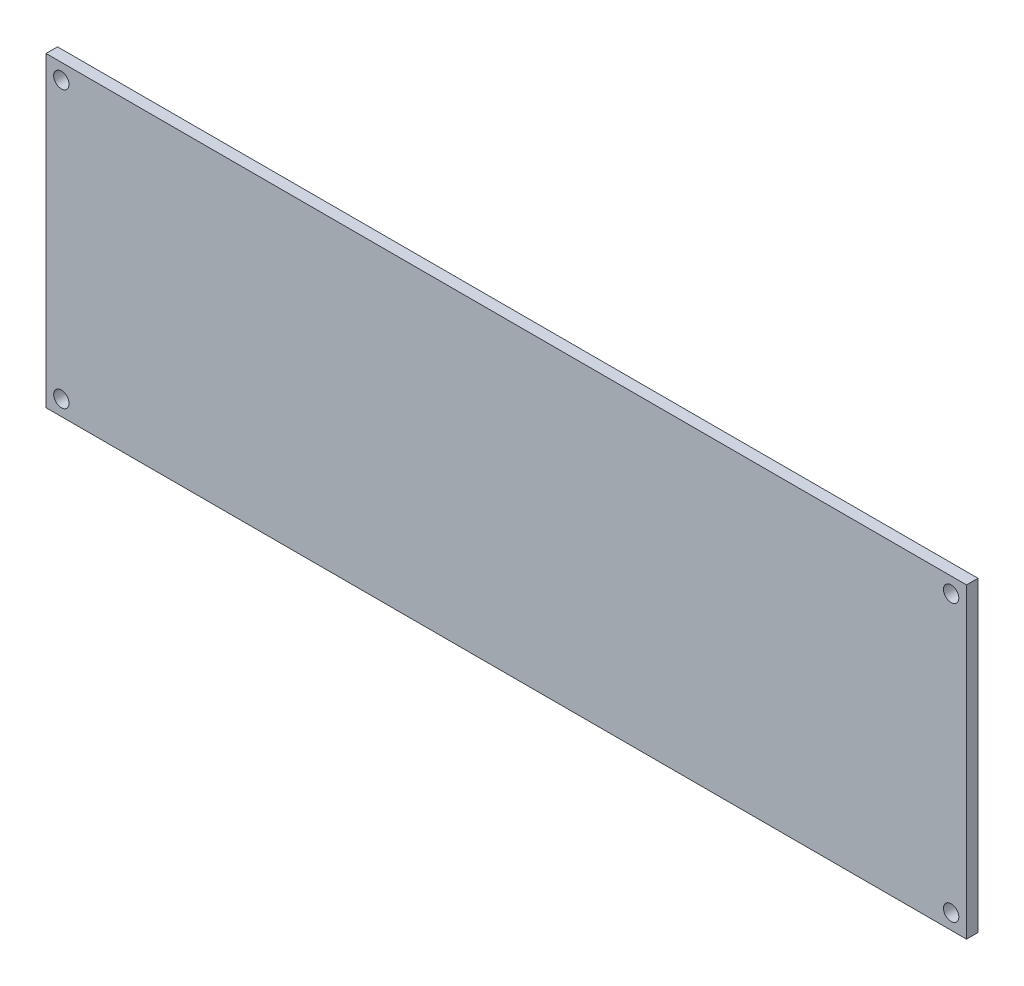
ISO-10303-21;
HEADER;
FILE_DESCRIPTION(('STEP AP214'),'2;1');
FILE_NAME('part.step','',(''),(''),'','','');
FILE_SCHEMA(('AUTOMOTIVE_DESIGN { 1 0 10303 214 1 1 1 1 }'));
ENDSEC;
DATA;
#1=APPLICATION_CONTEXT('core data for automotive mechanical design processes');
#2=APPLICATION_PROTOCOL_DEFINITION('international standard','automotive_design',2000,#1);
#3=PRODUCT_CONTEXT('',#1,'mechanical');
#4=PRODUCT('Part','Part','',(#3));
#5=PRODUCT_RELATED_PRODUCT_CATEGORY('part','',(#4));
#6=PRODUCT_DEFINITION_FORMATION('','',#4);
#7=PRODUCT_DEFINITION_CONTEXT('part definition',#1,'design');
#8=PRODUCT_DEFINITION('design','',#6,#7);
#9=PRODUCT_DEFINITION_SHAPE('','',#8);
#10=(LENGTH_UNIT() NAMED_UNIT(*) SI_UNIT(.MILLI.,.METRE.));
#11=(NAMED_UNIT(*) PLANE_ANGLE_UNIT() SI_UNIT($,.RADIAN.));
#12=(NAMED_UNIT(*) SI_UNIT($,.STERADIAN.) SOLID_ANGLE_UNIT());
#13=UNCERTAINTY_MEASURE_WITH_UNIT(LENGTH_MEASURE(1.E-05),#10,'distance_accuracy_value','');
#14=(GEOMETRIC_REPRESENTATION_CONTEXT(3) GLOBAL_UNCERTAINTY_ASSIGNED_CONTEXT((#13)) GLOBAL_UNIT_ASSIGNED_CONTEXT((#10,
#11,#12)) REPRESENTATION_CONTEXT('',''));
#15=CARTESIAN_POINT('',(0.,0.,0.));
#16=DIRECTION('',(0.,0.,1.));
#17=DIRECTION('',(1.,0.,0.));
#18=AXIS2_PLACEMENT_3D('',#15,#16,#17);
#19=CARTESIAN_POINT('',(0.,0.,1.5));
#20=DIRECTION('',(0.,0.,-1.));
#21=DIRECTION('',(-1.,0.,0.));
#22=AXIS2_PLACEMENT_3D('',#19,#20,#21);
#23=PLANE('',#22);
#24=DIRECTION('',(0.,-1.,0.));
#25=VECTOR('',#24,1.);
#26=CARTESIAN_POINT('',(0.,0.,1.5));
#27=LINE('',#26,#25);
#28=CARTESIAN_POINT('',(0.,40.,1.5));
#29=VERTEX_POINT('',#28);
#30=CARTESIAN_POINT('',(0.,0.,1.5));
#31=VERTEX_POINT('',#30);
#32=EDGE_CURVE('E92',#29,#31,#27,.T.);
#33=ORIENTED_EDGE('',*,*,#32,.T.);
#34=DIRECTION('',(1.,0.,0.));
#35=VECTOR('',#34,1.);
#36=CARTESIAN_POINT('',(0.,0.,1.5));
#37=LINE('',#36,#35);
#38=CARTESIAN_POINT('',(120.,0.,1.5));
#39=VERTEX_POINT('',#38);
#40=EDGE_CURVE('E87',#31,#39,#37,.T.);
#41=ORIENTED_EDGE('',*,*,#40,.T.);
#42=DIRECTION('',(0.,1.,0.));
#43=VECTOR('',#42,1.);
#44=CARTESIAN_POINT('',(120.,0.,1.5));
#45=LINE('',#44,#43);
#46=CARTESIAN_POINT('',(120.,40.,1.5));
#47=VERTEX_POINT('',#46);
#48=EDGE_CURVE('E90',#39,#47,#45,.T.);
#49=ORIENTED_EDGE('',*,*,#48,.T.);
#50=DIRECTION('',(-1.,0.,0.));
#51=VECTOR('',#50,1.);
#52=CARTESIAN_POINT('',(0.,40.,1.5));
#53=LINE('',#52,#51);
#54=EDGE_CURVE('E57',#47,#29,#53,.T.);
#55=ORIENTED_EDGE('',*,*,#54,.T.);
#56=EDGE_LOOP('',(#33,#41,#49,#55));
#57=FACE_BOUND('',#56,.T.);
#58=CARTESIAN_POINT('',(2.,38.,1.5));
#59=DIRECTION('',(0.,0.,1.));
#60=DIRECTION('',(1.,0.,0.));
#61=AXIS2_PLACEMENT_3D('',#58,#59,#60);
#62=CIRCLE('',#61,1.);
#63=CARTESIAN_POINT('',(3.,38.,1.5));
#64=VERTEX_POINT('',#63);
#65=EDGE_CURVE('E112',#64,#64,#62,.T.);
#66=ORIENTED_EDGE('',*,*,#65,.F.);
#67=EDGE_LOOP('',(#66));
#68=FACE_BOUND('',#67,.T.);
#69=CARTESIAN_POINT('',(118.,37.9999999999998,1.5));
#70=DIRECTION('',(0.,0.,1.));
#71=DIRECTION('',(-1.,0.,0.));
#72=AXIS2_PLACEMENT_3D('',#69,#70,#71);
#73=CIRCLE('',#72,0.999999999999985);
#74=CARTESIAN_POINT('',(117.,37.9999999999998,1.5));
#75=VERTEX_POINT('',#74);
#76=EDGE_CURVE('E134',#75,#75,#73,.T.);
#77=ORIENTED_EDGE('',*,*,#76,.F.);
#78=EDGE_LOOP('',(#77));
#79=FACE_BOUND('',#78,.T.);
#80=CARTESIAN_POINT('',(118.,2.00000000000022,1.5));
#81=DIRECTION('',(0.,0.,1.));
#82=DIRECTION('',(1.,0.,0.));
#83=AXIS2_PLACEMENT_3D('',#80,#81,#82);
#84=CIRCLE('',#83,0.999999999999985);
#85=CARTESIAN_POINT('',(119.,2.00000000000022,1.5));
#86=VERTEX_POINT('',#85);
#87=EDGE_CURVE('E142',#86,#86,#84,.T.);
#88=ORIENTED_EDGE('',*,*,#87,.F.);
#89=EDGE_LOOP('',(#88));
#90=FACE_BOUND('',#89,.T.);
#91=CARTESIAN_POINT('',(2.,2.,1.5));
#92=DIRECTION('',(0.,0.,1.));
#93=DIRECTION('',(-1.,0.,0.));
#94=AXIS2_PLACEMENT_3D('',#91,#92,#93);
#95=CIRCLE('',#94,1.);
#96=CARTESIAN_POINT('',(1.,2.,1.5));
#97=VERTEX_POINT('',#96);
#98=EDGE_CURVE('E150',#97,#97,#95,.T.);
#99=ORIENTED_EDGE('',*,*,#98,.F.);
#100=EDGE_LOOP('',(#99));
#101=FACE_BOUND('',#100,.T.);
#102=ADVANCED_FACE('F39',(#57,#68,#79,#90,#101),#23,.F.);
#103=CARTESIAN_POINT('',(0.,0.,0.));
#104=DIRECTION('',(0.,0.,-1.));
#105=DIRECTION('',(-1.,0.,0.));
#106=AXIS2_PLACEMENT_3D('',#103,#104,#105);
#107=PLANE('',#106);
#108=CARTESIAN_POINT('',(118.,2.00000000000022,0.));
#109=DIRECTION('',(0.,0.,1.));
#110=DIRECTION('',(1.,0.,0.));
#111=AXIS2_PLACEMENT_3D('',#108,#109,#110);
#112=CIRCLE('',#111,0.999999999999985);
#113=CARTESIAN_POINT('',(119.,2.00000000000022,0.));
#114=VERTEX_POINT('',#113);
#115=EDGE_CURVE('E146',#114,#114,#112,.T.);
#116=ORIENTED_EDGE('',*,*,#115,.T.);
#117=EDGE_LOOP('',(#116));
#118=FACE_BOUND('',#117,.T.);
#119=CARTESIAN_POINT('',(2.,38.,0.));
#120=DIRECTION('',(0.,0.,1.));
#121=DIRECTION('',(1.,0.,0.));
#122=AXIS2_PLACEMENT_3D('',#119,#120,#121);
#123=CIRCLE('',#122,1.);
#124=CARTESIAN_POINT('',(3.,38.,0.));
#125=VERTEX_POINT('',#124);
#126=EDGE_CURVE('E130',#125,#125,#123,.T.);
#127=ORIENTED_EDGE('',*,*,#126,.T.);
#128=EDGE_LOOP('',(#127));
#129=FACE_BOUND('',#128,.T.);
#130=DIRECTION('',(0.,-1.,0.));
#131=VECTOR('',#130,1.);
#132=CARTESIAN_POINT('',(0.,0.,0.));
#133=LINE('',#132,#131);
#134=CARTESIAN_POINT('',(0.,40.,0.));
#135=VERTEX_POINT('',#134);
#136=CARTESIAN_POINT('',(0.,0.,0.));
#137=VERTEX_POINT('',#136);
#138=EDGE_CURVE('E108',#135,#137,#133,.T.);
#139=ORIENTED_EDGE('',*,*,#138,.F.);
#140=DIRECTION('',(-1.,0.,0.));
#141=VECTOR('',#140,1.);
#142=CARTESIAN_POINT('',(0.,40.,0.));
#143=LINE('',#142,#141);
#144=CARTESIAN_POINT('',(120.,40.,0.));
#145=VERTEX_POINT('',#144);
#146=EDGE_CURVE('E80',#145,#135,#143,.T.);
#147=ORIENTED_EDGE('',*,*,#146,.F.);
#148=DIRECTION('',(0.,1.,0.));
#149=VECTOR('',#148,1.);
#150=CARTESIAN_POINT('',(120.,0.,0.));
#151=LINE('',#150,#149);
#152=CARTESIAN_POINT('',(120.,0.,0.));
#153=VERTEX_POINT('',#152);
#154=EDGE_CURVE('E74',#153,#145,#151,.T.);
#155=ORIENTED_EDGE('',*,*,#154,.F.);
#156=DIRECTION('',(1.,0.,0.));
#157=VECTOR('',#156,1.);
#158=CARTESIAN_POINT('',(0.,0.,0.));
#159=LINE('',#158,#157);
#160=EDGE_CURVE('E97',#137,#153,#159,.T.);
#161=ORIENTED_EDGE('',*,*,#160,.F.);
#162=EDGE_LOOP('',(#139,#147,#155,#161));
#163=FACE_BOUND('',#162,.T.);
#164=CARTESIAN_POINT('',(118.,37.9999999999998,0.));
#165=DIRECTION('',(0.,0.,1.));
#166=DIRECTION('',(-1.,0.,0.));
#167=AXIS2_PLACEMENT_3D('',#164,#165,#166);
#168=CIRCLE('',#167,0.999999999999985);
#169=CARTESIAN_POINT('',(117.,37.9999999999998,0.));
#170=VERTEX_POINT('',#169);
#171=EDGE_CURVE('E138',#170,#170,#168,.T.);
#172=ORIENTED_EDGE('',*,*,#171,.T.);
#173=EDGE_LOOP('',(#172));
#174=FACE_BOUND('',#173,.T.);
#175=CARTESIAN_POINT('',(2.,2.,0.));
#176=DIRECTION('',(0.,0.,1.));
#177=DIRECTION('',(-1.,0.,0.));
#178=AXIS2_PLACEMENT_3D('',#175,#176,#177);
#179=CIRCLE('',#178,1.);
#180=CARTESIAN_POINT('',(1.,2.,0.));
#181=VERTEX_POINT('',#180);
#182=EDGE_CURVE('E154',#181,#181,#179,.T.);
#183=ORIENTED_EDGE('',*,*,#182,.T.);
#184=EDGE_LOOP('',(#183));
#185=FACE_BOUND('',#184,.T.);
#186=ADVANCED_FACE('F125',(#118,#129,#163,#174,#185),#107,.T.);
#187=CARTESIAN_POINT('',(0.,0.,1.5));
#188=DIRECTION('',(1.,0.,0.));
#189=DIRECTION('',(0.,0.,-1.));
#190=AXIS2_PLACEMENT_3D('',#187,#188,#189);
#191=PLANE('',#190);
#192=ORIENTED_EDGE('',*,*,#138,.T.);
#193=DIRECTION('',(0.,0.,-1.));
#194=VECTOR('',#193,1.);
#195=CARTESIAN_POINT('',(0.,0.,1.5));
#196=LINE('',#195,#194);
#197=EDGE_CURVE('E11',#31,#137,#196,.T.);
#198=ORIENTED_EDGE('',*,*,#197,.F.);
#199=ORIENTED_EDGE('',*,*,#32,.F.);
#200=DIRECTION('',(0.,0.,-1.));
#201=VECTOR('',#200,1.);
#202=CARTESIAN_POINT('',(0.,40.,1.5));
#203=LINE('',#202,#201);
#204=EDGE_CURVE('E104',#29,#135,#203,.T.);
#205=ORIENTED_EDGE('',*,*,#204,.T.);
#206=EDGE_LOOP('',(#192,#198,#199,#205));
#207=FACE_BOUND('',#206,.T.);
#208=ADVANCED_FACE('F41',(#207),#191,.F.);
#209=CARTESIAN_POINT('',(0.,0.,1.5));
#210=DIRECTION('',(0.,1.,0.));
#211=DIRECTION('',(0.,0.,1.));
#212=AXIS2_PLACEMENT_3D('',#209,#210,#211);
#213=PLANE('',#212);
#214=ORIENTED_EDGE('',*,*,#160,.T.);
#215=DIRECTION('',(0.,0.,-1.));
#216=VECTOR('',#215,1.);
#217=CARTESIAN_POINT('',(120.,0.,1.5));
#218=LINE('',#217,#216);
#219=EDGE_CURVE('E49',#39,#153,#218,.T.);
#220=ORIENTED_EDGE('',*,*,#219,.F.);
#221=ORIENTED_EDGE('',*,*,#40,.F.);
#222=ORIENTED_EDGE('',*,*,#197,.T.);
#223=EDGE_LOOP('',(#214,#220,#221,#222));
#224=FACE_BOUND('',#223,.T.);
#225=ADVANCED_FACE('F96',(#224),#213,.F.);
#226=CARTESIAN_POINT('',(120.,0.,1.5));
#227=DIRECTION('',(-1.,0.,0.));
#228=DIRECTION('',(0.,-1.,0.));
#229=AXIS2_PLACEMENT_3D('',#226,#227,#228);
#230=PLANE('',#229);
#231=ORIENTED_EDGE('',*,*,#154,.T.);
#232=DIRECTION('',(0.,0.,-1.));
#233=VECTOR('',#232,1.);
#234=CARTESIAN_POINT('',(120.,40.,1.5));
#235=LINE('',#234,#233);
#236=EDGE_CURVE('E99',#47,#145,#235,.T.);
#237=ORIENTED_EDGE('',*,*,#236,.F.);
#238=ORIENTED_EDGE('',*,*,#48,.F.);
#239=ORIENTED_EDGE('',*,*,#219,.T.);
#240=EDGE_LOOP('',(#231,#237,#238,#239));
#241=FACE_BOUND('',#240,.T.);
#242=ADVANCED_FACE('F100',(#241),#230,.F.);
#243=CARTESIAN_POINT('',(0.,40.,1.5));
#244=DIRECTION('',(0.,-1.,0.));
#245=DIRECTION('',(0.,0.,-1.));
#246=AXIS2_PLACEMENT_3D('',#243,#244,#245);
#247=PLANE('',#246);
#248=ORIENTED_EDGE('',*,*,#146,.T.);
#249=ORIENTED_EDGE('',*,*,#204,.F.);
#250=ORIENTED_EDGE('',*,*,#54,.F.);
#251=ORIENTED_EDGE('',*,*,#236,.T.);
#252=EDGE_LOOP('',(#248,#249,#250,#251));
#253=FACE_BOUND('',#252,.T.);
#254=ADVANCED_FACE('F122',(#253),#247,.F.);
#255=CARTESIAN_POINT('',(2.,38.,1.5));
#256=DIRECTION('',(0.,0.,-1.));
#257=DIRECTION('',(-1.,0.,0.));
#258=AXIS2_PLACEMENT_3D('',#255,#256,#257);
#259=CYLINDRICAL_SURFACE('',#258,1.);
#260=ORIENTED_EDGE('',*,*,#65,.T.);
#261=EDGE_LOOP('',(#260));
#262=FACE_BOUND('',#261,.T.);
#263=ORIENTED_EDGE('',*,*,#126,.F.);
#264=EDGE_LOOP('',(#263));
#265=FACE_BOUND('',#264,.T.);
#266=ADVANCED_FACE('F173',(#262,#265),#259,.F.);
#267=CARTESIAN_POINT('',(118.,37.9999999999998,1.5));
#268=DIRECTION('',(0.,0.,-1.));
#269=DIRECTION('',(-1.,0.,0.));
#270=AXIS2_PLACEMENT_3D('',#267,#268,#269);
#271=CYLINDRICAL_SURFACE('',#270,0.999999999999985);
#272=ORIENTED_EDGE('',*,*,#76,.T.);
#273=EDGE_LOOP('',(#272));
#274=FACE_BOUND('',#273,.T.);
#275=ORIENTED_EDGE('',*,*,#171,.F.);
#276=EDGE_LOOP('',(#275));
#277=FACE_BOUND('',#276,.T.);
#278=ADVANCED_FACE('F219',(#274,#277),#271,.F.);
#279=CARTESIAN_POINT('',(118.,2.00000000000022,1.5));
#280=DIRECTION('',(0.,0.,-1.));
#281=DIRECTION('',(-1.,0.,0.));
#282=AXIS2_PLACEMENT_3D('',#279,#280,#281);
#283=CYLINDRICAL_SURFACE('',#282,0.999999999999985);
#284=ORIENTED_EDGE('',*,*,#87,.T.);
#285=EDGE_LOOP('',(#284));
#286=FACE_BOUND('',#285,.T.);
#287=ORIENTED_EDGE('',*,*,#115,.F.);
#288=EDGE_LOOP('',(#287));
#289=FACE_BOUND('',#288,.T.);
#290=ADVANCED_FACE('F227',(#286,#289),#283,.F.);
#291=CARTESIAN_POINT('',(2.,2.,1.5));
#292=DIRECTION('',(0.,0.,-1.));
#293=DIRECTION('',(-1.,0.,0.));
#294=AXIS2_PLACEMENT_3D('',#291,#292,#293);
#295=CYLINDRICAL_SURFACE('',#294,1.);
#296=ORIENTED_EDGE('',*,*,#98,.T.);
#297=EDGE_LOOP('',(#296));
#298=FACE_BOUND('',#297,.T.);
#299=ORIENTED_EDGE('',*,*,#182,.F.);
#300=EDGE_LOOP('',(#299));
#301=FACE_BOUND('',#300,.T.);
#302=ADVANCED_FACE('F162',(#298,#301),#295,.F.);
#303=CLOSED_SHELL('',(#102,#186,#208,#225,#242,#254,#266,#278,#290,#302));
#304=MANIFOLD_SOLID_BREP('B2',#303);
#305=ADVANCED_BREP_SHAPE_REPRESENTATION('',(#18,#304),#14);
#306=SHAPE_DEFINITION_REPRESENTATION(#9,#305);
ENDSEC;
END-ISO-10303-21;
